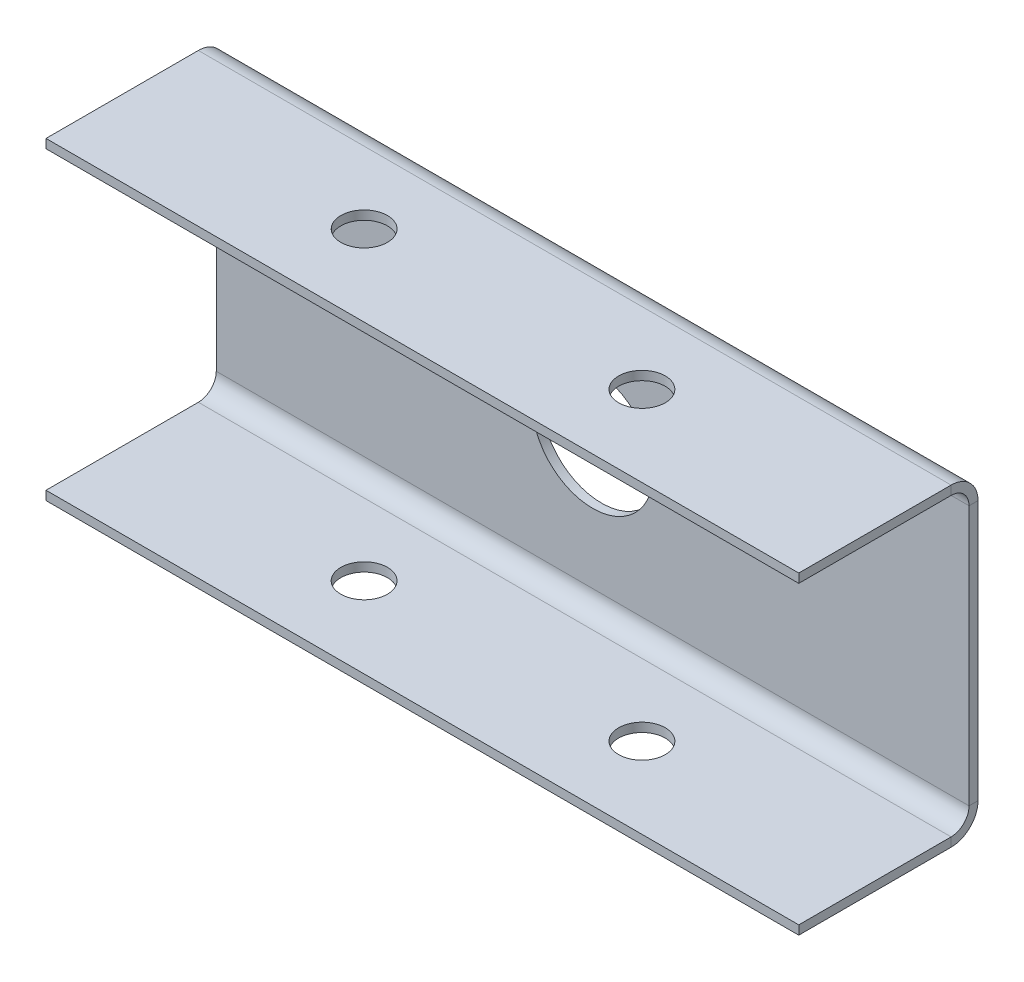
ISO-10303-21;
HEADER;
FILE_DESCRIPTION(('STEP AP214'),'2;1');
FILE_NAME('part.step','',(''),(''),'','','');
FILE_SCHEMA(('AUTOMOTIVE_DESIGN { 1 0 10303 214 1 1 1 1 }'));
ENDSEC;
DATA;
#1=APPLICATION_CONTEXT('core data for automotive mechanical design processes');
#2=APPLICATION_PROTOCOL_DEFINITION('international standard','automotive_design',2000,#1);
#3=PRODUCT_CONTEXT('',#1,'mechanical');
#4=PRODUCT('Part','Part','',(#3));
#5=PRODUCT_RELATED_PRODUCT_CATEGORY('part','',(#4));
#6=PRODUCT_DEFINITION_FORMATION('','',#4);
#7=PRODUCT_DEFINITION_CONTEXT('part definition',#1,'design');
#8=PRODUCT_DEFINITION('design','',#6,#7);
#9=PRODUCT_DEFINITION_SHAPE('','',#8);
#10=(LENGTH_UNIT() NAMED_UNIT(*) SI_UNIT(.MILLI.,.METRE.));
#11=(NAMED_UNIT(*) PLANE_ANGLE_UNIT() SI_UNIT($,.RADIAN.));
#12=(NAMED_UNIT(*) SI_UNIT($,.STERADIAN.) SOLID_ANGLE_UNIT());
#13=UNCERTAINTY_MEASURE_WITH_UNIT(LENGTH_MEASURE(1.E-05),#10,'distance_accuracy_value','');
#14=(GEOMETRIC_REPRESENTATION_CONTEXT(3) GLOBAL_UNCERTAINTY_ASSIGNED_CONTEXT((#13)) GLOBAL_UNIT_ASSIGNED_CONTEXT((#10,
#11,#12)) REPRESENTATION_CONTEXT('',''));
#15=CARTESIAN_POINT('',(0.,0.,0.));
#16=DIRECTION('',(0.,0.,1.));
#17=DIRECTION('',(1.,0.,0.));
#18=AXIS2_PLACEMENT_3D('',#15,#16,#17);
#19=CARTESIAN_POINT('',(84.,14.5,0.));
#20=DIRECTION('',(1.,0.,0.));
#21=DIRECTION('',(0.,0.,-1.));
#22=AXIS2_PLACEMENT_3D('',#19,#20,#21);
#23=PLANE('',#22);
#24=DIRECTION('',(0.,0.,1.));
#25=VECTOR('',#24,1.);
#26=CARTESIAN_POINT('',(84.,14.5,0.));
#27=LINE('',#26,#25);
#28=CARTESIAN_POINT('',(84.,14.5,0.));
#29=VERTEX_POINT('',#28);
#30=CARTESIAN_POINT('',(84.,14.5,1.00000000000001));
#31=VERTEX_POINT('',#30);
#32=EDGE_CURVE('E11',#29,#31,#27,.T.);
#33=ORIENTED_EDGE('',*,*,#32,.F.);
#34=CARTESIAN_POINT('',(84.,14.5,3.00000000000001));
#35=DIRECTION('',(1.,0.,0.));
#36=DIRECTION('',(0.,0.,-1.));
#37=AXIS2_PLACEMENT_3D('',#34,#35,#36);
#38=CIRCLE('',#37,3.);
#39=CARTESIAN_POINT('',(84.,17.5,3.00000000000001));
#40=VERTEX_POINT('',#39);
#41=EDGE_CURVE('E279',#40,#29,#38,.F.);
#42=ORIENTED_EDGE('',*,*,#41,.F.);
#43=DIRECTION('',(0.,1.,0.));
#44=VECTOR('',#43,1.);
#45=CARTESIAN_POINT('',(84.,16.5,3.00000000000001));
#46=LINE('',#45,#44);
#47=CARTESIAN_POINT('',(84.,16.5,3.00000000000001));
#48=VERTEX_POINT('',#47);
#49=EDGE_CURVE('E47',#48,#40,#46,.T.);
#50=ORIENTED_EDGE('',*,*,#49,.F.);
#51=CARTESIAN_POINT('',(84.,14.5,3.00000000000001));
#52=DIRECTION('',(1.,0.,0.));
#53=DIRECTION('',(0.,0.,-1.));
#54=AXIS2_PLACEMENT_3D('',#51,#52,#53);
#55=CIRCLE('',#54,2.);
#56=EDGE_CURVE('E149',#48,#31,#55,.F.);
#57=ORIENTED_EDGE('',*,*,#56,.T.);
#58=EDGE_LOOP('',(#33,#42,#50,#57));
#59=FACE_BOUND('',#58,.T.);
#60=ADVANCED_FACE('F38',(#59),#23,.T.);
#61=CARTESIAN_POINT('',(84.,16.5,3.00000000000001));
#62=DIRECTION('',(1.,0.,0.));
#63=DIRECTION('',(0.,0.,-1.));
#64=AXIS2_PLACEMENT_3D('',#61,#62,#63);
#65=PLANE('',#64);
#66=DIRECTION('',(0.,-1.,0.));
#67=VECTOR('',#66,1.);
#68=CARTESIAN_POINT('',(84.,17.5,0.));
#69=LINE('',#68,#67);
#70=CARTESIAN_POINT('',(84.,-14.5,0.));
#71=VERTEX_POINT('',#70);
#72=EDGE_CURVE('E143',#29,#71,#69,.T.);
#73=ORIENTED_EDGE('',*,*,#72,.F.);
#74=ORIENTED_EDGE('',*,*,#32,.T.);
#75=DIRECTION('',(0.,-1.,0.));
#76=VECTOR('',#75,1.);
#77=CARTESIAN_POINT('',(84.,17.5,1.00000000000001));
#78=LINE('',#77,#76);
#79=CARTESIAN_POINT('',(84.,-14.5,0.999999999999996));
#80=VERTEX_POINT('',#79);
#81=EDGE_CURVE('E140',#31,#80,#78,.T.);
#82=ORIENTED_EDGE('',*,*,#81,.T.);
#83=DIRECTION('',(0.,0.,-1.));
#84=VECTOR('',#83,1.);
#85=CARTESIAN_POINT('',(84.,-14.5,0.999999999999996));
#86=LINE('',#85,#84);
#87=EDGE_CURVE('E232',#80,#71,#86,.T.);
#88=ORIENTED_EDGE('',*,*,#87,.T.);
#89=EDGE_LOOP('',(#73,#74,#82,#88));
#90=FACE_BOUND('',#89,.T.);
#91=ADVANCED_FACE('F138',(#90),#65,.T.);
#92=CARTESIAN_POINT('',(0.,17.5,3.00000000000001));
#93=DIRECTION('',(-1.,0.,0.));
#94=DIRECTION('',(0.,0.,1.));
#95=AXIS2_PLACEMENT_3D('',#92,#93,#94);
#96=PLANE('',#95);
#97=DIRECTION('',(0.,-1.,0.));
#98=VECTOR('',#97,1.);
#99=CARTESIAN_POINT('',(0.,17.5,3.00000000000001));
#100=LINE('',#99,#98);
#101=CARTESIAN_POINT('',(0.,17.5,3.00000000000001));
#102=VERTEX_POINT('',#101);
#103=CARTESIAN_POINT('',(0.,16.5,3.00000000000001));
#104=VERTEX_POINT('',#103);
#105=EDGE_CURVE('E237',#102,#104,#100,.T.);
#106=ORIENTED_EDGE('',*,*,#105,.F.);
#107=CARTESIAN_POINT('',(0.,14.5,3.00000000000001));
#108=DIRECTION('',(1.,0.,0.));
#109=DIRECTION('',(0.,0.,-1.));
#110=AXIS2_PLACEMENT_3D('',#107,#108,#109);
#111=CIRCLE('',#110,3.);
#112=CARTESIAN_POINT('',(0.,14.5,0.));
#113=VERTEX_POINT('',#112);
#114=EDGE_CURVE('E189',#102,#113,#111,.F.);
#115=ORIENTED_EDGE('',*,*,#114,.T.);
#116=DIRECTION('',(0.,0.,-1.));
#117=VECTOR('',#116,1.);
#118=CARTESIAN_POINT('',(0.,14.5,1.00000000000001));
#119=LINE('',#118,#117);
#120=CARTESIAN_POINT('',(0.,14.5,1.00000000000001));
#121=VERTEX_POINT('',#120);
#122=EDGE_CURVE('E235',#121,#113,#119,.T.);
#123=ORIENTED_EDGE('',*,*,#122,.F.);
#124=CARTESIAN_POINT('',(0.,14.5,3.00000000000001));
#125=DIRECTION('',(1.,0.,0.));
#126=DIRECTION('',(0.,0.,-1.));
#127=AXIS2_PLACEMENT_3D('',#124,#125,#126);
#128=CIRCLE('',#127,2.);
#129=EDGE_CURVE('E161',#104,#121,#128,.F.);
#130=ORIENTED_EDGE('',*,*,#129,.F.);
#131=EDGE_LOOP('',(#106,#115,#123,#130));
#132=FACE_BOUND('',#131,.T.);
#133=ADVANCED_FACE('F297',(#132),#96,.T.);
#134=CARTESIAN_POINT('',(0.,14.5,1.00000000000001));
#135=DIRECTION('',(-1.,0.,0.));
#136=DIRECTION('',(0.,0.,1.));
#137=AXIS2_PLACEMENT_3D('',#134,#135,#136);
#138=PLANE('',#137);
#139=DIRECTION('',(0.,0.,-1.));
#140=VECTOR('',#139,1.);
#141=CARTESIAN_POINT('',(0.,17.5,0.));
#142=LINE('',#141,#140);
#143=CARTESIAN_POINT('',(0.,17.5,20.));
#144=VERTEX_POINT('',#143);
#145=EDGE_CURVE('E192',#144,#102,#142,.T.);
#146=ORIENTED_EDGE('',*,*,#145,.T.);
#147=ORIENTED_EDGE('',*,*,#105,.T.);
#148=DIRECTION('',(0.,0.,-1.));
#149=VECTOR('',#148,1.);
#150=CARTESIAN_POINT('',(0.,16.5,0.));
#151=LINE('',#150,#149);
#152=CARTESIAN_POINT('',(0.,16.5,20.));
#153=VERTEX_POINT('',#152);
#154=EDGE_CURVE('E198',#153,#104,#151,.T.);
#155=ORIENTED_EDGE('',*,*,#154,.F.);
#156=DIRECTION('',(0.,1.,0.));
#157=VECTOR('',#156,1.);
#158=CARTESIAN_POINT('',(0.,16.5,20.));
#159=LINE('',#158,#157);
#160=EDGE_CURVE('E195',#153,#144,#159,.T.);
#161=ORIENTED_EDGE('',*,*,#160,.T.);
#162=EDGE_LOOP('',(#146,#147,#155,#161));
#163=FACE_BOUND('',#162,.T.);
#164=ADVANCED_FACE('F343',(#163),#138,.T.);
#165=CARTESIAN_POINT('',(84.,-17.5,3.));
#166=DIRECTION('',(1.,0.,0.));
#167=DIRECTION('',(0.,0.,-1.));
#168=AXIS2_PLACEMENT_3D('',#165,#166,#167);
#169=PLANE('',#168);
#170=DIRECTION('',(0.,1.,0.));
#171=VECTOR('',#170,1.);
#172=CARTESIAN_POINT('',(84.,-17.5,3.));
#173=LINE('',#172,#171);
#174=CARTESIAN_POINT('',(84.,-17.5,3.));
#175=VERTEX_POINT('',#174);
#176=CARTESIAN_POINT('',(84.,-16.5,3.));
#177=VERTEX_POINT('',#176);
#178=EDGE_CURVE('E56',#175,#177,#173,.T.);
#179=ORIENTED_EDGE('',*,*,#178,.F.);
#180=CARTESIAN_POINT('',(84.,-14.5,3.));
#181=DIRECTION('',(1.,0.,0.));
#182=DIRECTION('',(0.,0.,-1.));
#183=AXIS2_PLACEMENT_3D('',#180,#181,#182);
#184=CIRCLE('',#183,3.);
#185=EDGE_CURVE('E275',#71,#175,#184,.F.);
#186=ORIENTED_EDGE('',*,*,#185,.F.);
#187=ORIENTED_EDGE('',*,*,#87,.F.);
#188=CARTESIAN_POINT('',(84.,-14.5,3.));
#189=DIRECTION('',(1.,0.,0.));
#190=DIRECTION('',(0.,0.,-1.));
#191=AXIS2_PLACEMENT_3D('',#188,#189,#190);
#192=CIRCLE('',#191,2.);
#193=EDGE_CURVE('E169',#80,#177,#192,.F.);
#194=ORIENTED_EDGE('',*,*,#193,.T.);
#195=EDGE_LOOP('',(#179,#186,#187,#194));
#196=FACE_BOUND('',#195,.T.);
#197=ADVANCED_FACE('F348',(#196),#169,.T.);
#198=CARTESIAN_POINT('',(84.,-14.5,0.999999999999996));
#199=DIRECTION('',(1.,0.,0.));
#200=DIRECTION('',(0.,0.,-1.));
#201=AXIS2_PLACEMENT_3D('',#198,#199,#200);
#202=PLANE('',#201);
#203=DIRECTION('',(0.,0.,1.));
#204=VECTOR('',#203,1.);
#205=CARTESIAN_POINT('',(84.,-17.5,0.));
#206=LINE('',#205,#204);
#207=CARTESIAN_POINT('',(84.,-17.5,20.));
#208=VERTEX_POINT('',#207);
#209=EDGE_CURVE('E272',#175,#208,#206,.T.);
#210=ORIENTED_EDGE('',*,*,#209,.F.);
#211=ORIENTED_EDGE('',*,*,#178,.T.);
#212=DIRECTION('',(0.,0.,1.));
#213=VECTOR('',#212,1.);
#214=CARTESIAN_POINT('',(84.,-16.5,0.));
#215=LINE('',#214,#213);
#216=CARTESIAN_POINT('',(84.,-16.5,20.));
#217=VERTEX_POINT('',#216);
#218=EDGE_CURVE('E110',#177,#217,#215,.T.);
#219=ORIENTED_EDGE('',*,*,#218,.T.);
#220=DIRECTION('',(0.,1.,0.));
#221=VECTOR('',#220,1.);
#222=CARTESIAN_POINT('',(84.,-17.5,20.));
#223=LINE('',#222,#221);
#224=EDGE_CURVE('E269',#208,#217,#223,.T.);
#225=ORIENTED_EDGE('',*,*,#224,.F.);
#226=EDGE_LOOP('',(#210,#211,#219,#225));
#227=FACE_BOUND('',#226,.T.);
#228=ADVANCED_FACE('F324',(#227),#202,.T.);
#229=CARTESIAN_POINT('',(0.,-14.5,0.));
#230=DIRECTION('',(-1.,0.,0.));
#231=DIRECTION('',(0.,0.,1.));
#232=AXIS2_PLACEMENT_3D('',#229,#230,#231);
#233=PLANE('',#232);
#234=DIRECTION('',(0.,0.,1.));
#235=VECTOR('',#234,1.);
#236=CARTESIAN_POINT('',(0.,-14.5,0.));
#237=LINE('',#236,#235);
#238=CARTESIAN_POINT('',(0.,-14.5,0.));
#239=VERTEX_POINT('',#238);
#240=CARTESIAN_POINT('',(0.,-14.5,0.999999999999996));
#241=VERTEX_POINT('',#240);
#242=EDGE_CURVE('E97',#239,#241,#237,.T.);
#243=ORIENTED_EDGE('',*,*,#242,.F.);
#244=CARTESIAN_POINT('',(0.,-14.5,3.));
#245=DIRECTION('',(1.,0.,0.));
#246=DIRECTION('',(0.,0.,-1.));
#247=AXIS2_PLACEMENT_3D('',#244,#245,#246);
#248=CIRCLE('',#247,3.);
#249=CARTESIAN_POINT('',(0.,-17.5,3.));
#250=VERTEX_POINT('',#249);
#251=EDGE_CURVE('E185',#239,#250,#248,.F.);
#252=ORIENTED_EDGE('',*,*,#251,.T.);
#253=DIRECTION('',(0.,-1.,0.));
#254=VECTOR('',#253,1.);
#255=CARTESIAN_POINT('',(0.,-16.5,3.));
#256=LINE('',#255,#254);
#257=CARTESIAN_POINT('',(0.,-16.5,3.));
#258=VERTEX_POINT('',#257);
#259=EDGE_CURVE('E104',#258,#250,#256,.T.);
#260=ORIENTED_EDGE('',*,*,#259,.F.);
#261=CARTESIAN_POINT('',(0.,-14.5,3.));
#262=DIRECTION('',(1.,0.,0.));
#263=DIRECTION('',(0.,0.,-1.));
#264=AXIS2_PLACEMENT_3D('',#261,#262,#263);
#265=CIRCLE('',#264,2.);
#266=EDGE_CURVE('E204',#241,#258,#265,.F.);
#267=ORIENTED_EDGE('',*,*,#266,.F.);
#268=EDGE_LOOP('',(#243,#252,#260,#267));
#269=FACE_BOUND('',#268,.T.);
#270=ADVANCED_FACE('F312',(#269),#233,.T.);
#271=CARTESIAN_POINT('',(0.,-16.5,3.));
#272=DIRECTION('',(-1.,0.,0.));
#273=DIRECTION('',(0.,0.,1.));
#274=AXIS2_PLACEMENT_3D('',#271,#272,#273);
#275=PLANE('',#274);
#276=DIRECTION('',(0.,-1.,0.));
#277=VECTOR('',#276,1.);
#278=CARTESIAN_POINT('',(0.,17.5,0.));
#279=LINE('',#278,#277);
#280=EDGE_CURVE('E187',#113,#239,#279,.T.);
#281=ORIENTED_EDGE('',*,*,#280,.T.);
#282=ORIENTED_EDGE('',*,*,#242,.T.);
#283=DIRECTION('',(0.,-1.,0.));
#284=VECTOR('',#283,1.);
#285=CARTESIAN_POINT('',(0.,17.5,1.00000000000001));
#286=LINE('',#285,#284);
#287=EDGE_CURVE('E202',#121,#241,#286,.T.);
#288=ORIENTED_EDGE('',*,*,#287,.F.);
#289=ORIENTED_EDGE('',*,*,#122,.T.);
#290=EDGE_LOOP('',(#281,#282,#288,#289));
#291=FACE_BOUND('',#290,.T.);
#292=ADVANCED_FACE('F299',(#291),#275,.T.);
#293=CARTESIAN_POINT('',(84.,-16.5,0.));
#294=DIRECTION('',(0.,-1.,0.));
#295=DIRECTION('',(0.,0.,-1.));
#296=AXIS2_PLACEMENT_3D('',#293,#294,#295);
#297=PLANE('',#296);
#298=CARTESIAN_POINT('',(57.5,-16.5,11.));
#299=DIRECTION('',(0.,-1.,0.));
#300=DIRECTION('',(0.,0.,-1.));
#301=AXIS2_PLACEMENT_3D('',#298,#299,#300);
#302=CIRCLE('',#301,2.6);
#303=CARTESIAN_POINT('',(57.5,-16.5,8.4));
#304=VERTEX_POINT('',#303);
#305=EDGE_CURVE('E245',#304,#304,#302,.T.);
#306=ORIENTED_EDGE('',*,*,#305,.T.);
#307=EDGE_LOOP('',(#306));
#308=FACE_BOUND('',#307,.T.);
#309=CARTESIAN_POINT('',(26.5,-16.5,11.));
#310=DIRECTION('',(0.,-1.,0.));
#311=DIRECTION('',(0.,0.,-1.));
#312=AXIS2_PLACEMENT_3D('',#309,#310,#311);
#313=CIRCLE('',#312,2.6);
#314=CARTESIAN_POINT('',(26.5,-16.5,8.4));
#315=VERTEX_POINT('',#314);
#316=EDGE_CURVE('E179',#315,#315,#313,.T.);
#317=ORIENTED_EDGE('',*,*,#316,.T.);
#318=EDGE_LOOP('',(#317));
#319=FACE_BOUND('',#318,.T.);
#320=DIRECTION('',(0.,0.,1.));
#321=VECTOR('',#320,1.);
#322=CARTESIAN_POINT('',(0.,-16.5,0.));
#323=LINE('',#322,#321);
#324=CARTESIAN_POINT('',(0.,-16.5,20.));
#325=VERTEX_POINT('',#324);
#326=EDGE_CURVE('E175',#258,#325,#323,.T.);
#327=ORIENTED_EDGE('',*,*,#326,.T.);
#328=DIRECTION('',(-1.,0.,0.));
#329=VECTOR('',#328,1.);
#330=CARTESIAN_POINT('',(84.,-16.5,20.));
#331=LINE('',#330,#329);
#332=EDGE_CURVE('E228',#217,#325,#331,.T.);
#333=ORIENTED_EDGE('',*,*,#332,.F.);
#334=ORIENTED_EDGE('',*,*,#218,.F.);
#335=DIRECTION('',(-1.,0.,0.));
#336=VECTOR('',#335,1.);
#337=CARTESIAN_POINT('',(84.,-16.5,3.));
#338=LINE('',#337,#336);
#339=EDGE_CURVE('E171',#177,#258,#338,.T.);
#340=ORIENTED_EDGE('',*,*,#339,.T.);
#341=EDGE_LOOP('',(#327,#333,#334,#340));
#342=FACE_BOUND('',#341,.T.);
#343=ADVANCED_FACE('F318',(#308,#319,#342),#297,.F.);
#344=CARTESIAN_POINT('',(84.,-17.5,20.));
#345=DIRECTION('',(0.,0.,1.));
#346=DIRECTION('',(1.,0.,0.));
#347=AXIS2_PLACEMENT_3D('',#344,#345,#346);
#348=PLANE('',#347);
#349=DIRECTION('',(0.,1.,0.));
#350=VECTOR('',#349,1.);
#351=CARTESIAN_POINT('',(0.,-17.5,20.));
#352=LINE('',#351,#350);
#353=CARTESIAN_POINT('',(0.,-17.5,20.));
#354=VERTEX_POINT('',#353);
#355=EDGE_CURVE('E178',#354,#325,#352,.T.);
#356=ORIENTED_EDGE('',*,*,#355,.F.);
#357=DIRECTION('',(-1.,0.,0.));
#358=VECTOR('',#357,1.);
#359=CARTESIAN_POINT('',(84.,-17.5,20.));
#360=LINE('',#359,#358);
#361=EDGE_CURVE('E226',#208,#354,#360,.T.);
#362=ORIENTED_EDGE('',*,*,#361,.F.);
#363=ORIENTED_EDGE('',*,*,#224,.T.);
#364=ORIENTED_EDGE('',*,*,#332,.T.);
#365=EDGE_LOOP('',(#356,#362,#363,#364));
#366=FACE_BOUND('',#365,.T.);
#367=ADVANCED_FACE('F323',(#366),#348,.T.);
#368=CARTESIAN_POINT('',(84.,-17.5,0.));
#369=DIRECTION('',(0.,-1.,0.));
#370=DIRECTION('',(0.,0.,-1.));
#371=AXIS2_PLACEMENT_3D('',#368,#369,#370);
#372=PLANE('',#371);
#373=CARTESIAN_POINT('',(57.5,-17.5,11.));
#374=DIRECTION('',(0.,1.,0.));
#375=DIRECTION('',(0.,0.,1.));
#376=AXIS2_PLACEMENT_3D('',#373,#374,#375);
#377=CIRCLE('',#376,2.6);
#378=CARTESIAN_POINT('',(57.5,-17.5,13.6));
#379=VERTEX_POINT('',#378);
#380=EDGE_CURVE('E246',#379,#379,#377,.T.);
#381=ORIENTED_EDGE('',*,*,#380,.T.);
#382=EDGE_LOOP('',(#381));
#383=FACE_BOUND('',#382,.T.);
#384=CARTESIAN_POINT('',(26.5,-17.5,11.));
#385=DIRECTION('',(0.,1.,0.));
#386=DIRECTION('',(0.,0.,1.));
#387=AXIS2_PLACEMENT_3D('',#384,#385,#386);
#388=CIRCLE('',#387,2.6);
#389=CARTESIAN_POINT('',(26.5,-17.5,13.6));
#390=VERTEX_POINT('',#389);
#391=EDGE_CURVE('E242',#390,#390,#388,.T.);
#392=ORIENTED_EDGE('',*,*,#391,.T.);
#393=EDGE_LOOP('',(#392));
#394=FACE_BOUND('',#393,.T.);
#395=DIRECTION('',(0.,0.,1.));
#396=VECTOR('',#395,1.);
#397=CARTESIAN_POINT('',(0.,-17.5,0.));
#398=LINE('',#397,#396);
#399=EDGE_CURVE('E182',#250,#354,#398,.T.);
#400=ORIENTED_EDGE('',*,*,#399,.F.);
#401=DIRECTION('',(-1.,0.,0.));
#402=VECTOR('',#401,1.);
#403=CARTESIAN_POINT('',(84.,-17.5,3.));
#404=LINE('',#403,#402);
#405=EDGE_CURVE('E223',#175,#250,#404,.T.);
#406=ORIENTED_EDGE('',*,*,#405,.F.);
#407=ORIENTED_EDGE('',*,*,#209,.T.);
#408=ORIENTED_EDGE('',*,*,#361,.T.);
#409=EDGE_LOOP('',(#400,#406,#407,#408));
#410=FACE_BOUND('',#409,.T.);
#411=ADVANCED_FACE('F326',(#383,#394,#410),#372,.T.);
#412=CARTESIAN_POINT('',(84.,-14.5,3.));
#413=DIRECTION('',(-1.,0.,0.));
#414=DIRECTION('',(0.,0.,1.));
#415=AXIS2_PLACEMENT_3D('',#412,#413,#414);
#416=CYLINDRICAL_SURFACE('',#415,3.);
#417=ORIENTED_EDGE('',*,*,#251,.F.);
#418=DIRECTION('',(-1.,0.,0.));
#419=VECTOR('',#418,1.);
#420=CARTESIAN_POINT('',(84.,-14.5,0.));
#421=LINE('',#420,#419);
#422=EDGE_CURVE('E220',#71,#239,#421,.T.);
#423=ORIENTED_EDGE('',*,*,#422,.F.);
#424=ORIENTED_EDGE('',*,*,#185,.T.);
#425=ORIENTED_EDGE('',*,*,#405,.T.);
#426=EDGE_LOOP('',(#417,#423,#424,#425));
#427=FACE_BOUND('',#426,.T.);
#428=ADVANCED_FACE('F309',(#427),#416,.T.);
#429=CARTESIAN_POINT('',(84.,17.5,0.));
#430=DIRECTION('',(0.,0.,-1.));
#431=DIRECTION('',(0.,1.,0.));
#432=AXIS2_PLACEMENT_3D('',#429,#430,#431);
#433=PLANE('',#432);
#434=CARTESIAN_POINT('',(42.,0.,0.));
#435=DIRECTION('',(0.,0.,-1.));
#436=DIRECTION('',(-1.,0.,0.));
#437=AXIS2_PLACEMENT_3D('',#434,#435,#436);
#438=CIRCLE('',#437,6.75);
#439=CARTESIAN_POINT('',(35.25,0.,0.));
#440=VERTEX_POINT('',#439);
#441=EDGE_CURVE('E260',#440,#440,#438,.T.);
#442=ORIENTED_EDGE('',*,*,#441,.F.);
#443=EDGE_LOOP('',(#442));
#444=FACE_BOUND('',#443,.T.);
#445=ORIENTED_EDGE('',*,*,#280,.F.);
#446=DIRECTION('',(-1.,0.,0.));
#447=VECTOR('',#446,1.);
#448=CARTESIAN_POINT('',(84.,14.5,0.));
#449=LINE('',#448,#447);
#450=EDGE_CURVE('E217',#29,#113,#449,.T.);
#451=ORIENTED_EDGE('',*,*,#450,.F.);
#452=ORIENTED_EDGE('',*,*,#72,.T.);
#453=ORIENTED_EDGE('',*,*,#422,.T.);
#454=EDGE_LOOP('',(#445,#451,#452,#453));
#455=FACE_BOUND('',#454,.T.);
#456=ADVANCED_FACE('F304',(#444,#455),#433,.T.);
#457=CARTESIAN_POINT('',(84.,14.5,3.00000000000001));
#458=DIRECTION('',(-1.,0.,0.));
#459=DIRECTION('',(0.,0.,1.));
#460=AXIS2_PLACEMENT_3D('',#457,#458,#459);
#461=CYLINDRICAL_SURFACE('',#460,3.);
#462=ORIENTED_EDGE('',*,*,#114,.F.);
#463=DIRECTION('',(-1.,0.,0.));
#464=VECTOR('',#463,1.);
#465=CARTESIAN_POINT('',(84.,17.5,3.00000000000001));
#466=LINE('',#465,#464);
#467=EDGE_CURVE('E214',#40,#102,#466,.T.);
#468=ORIENTED_EDGE('',*,*,#467,.F.);
#469=ORIENTED_EDGE('',*,*,#41,.T.);
#470=ORIENTED_EDGE('',*,*,#450,.T.);
#471=EDGE_LOOP('',(#462,#468,#469,#470));
#472=FACE_BOUND('',#471,.T.);
#473=ADVANCED_FACE('F302',(#472),#461,.T.);
#474=CARTESIAN_POINT('',(84.,17.5,0.));
#475=DIRECTION('',(0.,1.,0.));
#476=DIRECTION('',(0.,0.,1.));
#477=AXIS2_PLACEMENT_3D('',#474,#475,#476);
#478=PLANE('',#477);
#479=CARTESIAN_POINT('',(57.5,17.5,11.));
#480=DIRECTION('',(0.,1.,0.));
#481=DIRECTION('',(0.,0.,1.));
#482=AXIS2_PLACEMENT_3D('',#479,#480,#481);
#483=CIRCLE('',#482,2.6);
#484=CARTESIAN_POINT('',(57.5,17.5,13.6));
#485=VERTEX_POINT('',#484);
#486=EDGE_CURVE('E253',#485,#485,#483,.T.);
#487=ORIENTED_EDGE('',*,*,#486,.F.);
#488=EDGE_LOOP('',(#487));
#489=FACE_BOUND('',#488,.T.);
#490=CARTESIAN_POINT('',(26.5,17.5,11.));
#491=DIRECTION('',(0.,1.,0.));
#492=DIRECTION('',(0.,0.,1.));
#493=AXIS2_PLACEMENT_3D('',#490,#491,#492);
#494=CIRCLE('',#493,2.6);
#495=CARTESIAN_POINT('',(26.5,17.5,13.6));
#496=VERTEX_POINT('',#495);
#497=EDGE_CURVE('E250',#496,#496,#494,.T.);
#498=ORIENTED_EDGE('',*,*,#497,.F.);
#499=EDGE_LOOP('',(#498));
#500=FACE_BOUND('',#499,.T.);
#501=ORIENTED_EDGE('',*,*,#145,.F.);
#502=DIRECTION('',(-1.,0.,0.));
#503=VECTOR('',#502,1.);
#504=CARTESIAN_POINT('',(84.,17.5,20.));
#505=LINE('',#504,#503);
#506=CARTESIAN_POINT('',(84.,17.5,20.));
#507=VERTEX_POINT('',#506);
#508=EDGE_CURVE('E212',#507,#144,#505,.T.);
#509=ORIENTED_EDGE('',*,*,#508,.F.);
#510=DIRECTION('',(0.,0.,-1.));
#511=VECTOR('',#510,1.);
#512=CARTESIAN_POINT('',(84.,17.5,0.));
#513=LINE('',#512,#511);
#514=EDGE_CURVE('E281',#507,#40,#513,.T.);
#515=ORIENTED_EDGE('',*,*,#514,.T.);
#516=ORIENTED_EDGE('',*,*,#467,.T.);
#517=EDGE_LOOP('',(#501,#509,#515,#516));
#518=FACE_BOUND('',#517,.T.);
#519=ADVANCED_FACE('F400',(#489,#500,#518),#478,.T.);
#520=CARTESIAN_POINT('',(84.,16.5,20.));
#521=DIRECTION('',(0.,0.,1.));
#522=DIRECTION('',(1.,0.,0.));
#523=AXIS2_PLACEMENT_3D('',#520,#521,#522);
#524=PLANE('',#523);
#525=ORIENTED_EDGE('',*,*,#160,.F.);
#526=DIRECTION('',(-1.,0.,0.));
#527=VECTOR('',#526,1.);
#528=CARTESIAN_POINT('',(84.,16.5,20.));
#529=LINE('',#528,#527);
#530=CARTESIAN_POINT('',(84.,16.5,20.));
#531=VERTEX_POINT('',#530);
#532=EDGE_CURVE('E210',#531,#153,#529,.T.);
#533=ORIENTED_EDGE('',*,*,#532,.F.);
#534=DIRECTION('',(0.,1.,0.));
#535=VECTOR('',#534,1.);
#536=CARTESIAN_POINT('',(84.,16.5,20.));
#537=LINE('',#536,#535);
#538=EDGE_CURVE('E284',#531,#507,#537,.T.);
#539=ORIENTED_EDGE('',*,*,#538,.T.);
#540=ORIENTED_EDGE('',*,*,#508,.T.);
#541=EDGE_LOOP('',(#525,#533,#539,#540));
#542=FACE_BOUND('',#541,.T.);
#543=ADVANCED_FACE('F397',(#542),#524,.T.);
#544=CARTESIAN_POINT('',(84.,16.5,0.));
#545=DIRECTION('',(0.,1.,0.));
#546=DIRECTION('',(0.,0.,1.));
#547=AXIS2_PLACEMENT_3D('',#544,#545,#546);
#548=PLANE('',#547);
#549=CARTESIAN_POINT('',(57.5,16.5,11.));
#550=DIRECTION('',(0.,1.,0.));
#551=DIRECTION('',(0.,0.,1.));
#552=AXIS2_PLACEMENT_3D('',#549,#550,#551);
#553=CIRCLE('',#552,2.6);
#554=CARTESIAN_POINT('',(57.5,16.5,13.6));
#555=VERTEX_POINT('',#554);
#556=EDGE_CURVE('E243',#555,#555,#553,.T.);
#557=ORIENTED_EDGE('',*,*,#556,.T.);
#558=EDGE_LOOP('',(#557));
#559=FACE_BOUND('',#558,.T.);
#560=CARTESIAN_POINT('',(26.5,16.5,11.));
#561=DIRECTION('',(0.,1.,0.));
#562=DIRECTION('',(0.,0.,1.));
#563=AXIS2_PLACEMENT_3D('',#560,#561,#562);
#564=CIRCLE('',#563,2.6);
#565=CARTESIAN_POINT('',(26.5,16.5,13.6));
#566=VERTEX_POINT('',#565);
#567=EDGE_CURVE('E240',#566,#566,#564,.T.);
#568=ORIENTED_EDGE('',*,*,#567,.T.);
#569=EDGE_LOOP('',(#568));
#570=FACE_BOUND('',#569,.T.);
#571=ORIENTED_EDGE('',*,*,#154,.T.);
#572=DIRECTION('',(-1.,0.,0.));
#573=VECTOR('',#572,1.);
#574=CARTESIAN_POINT('',(84.,16.5,3.00000000000001));
#575=LINE('',#574,#573);
#576=EDGE_CURVE('E163',#48,#104,#575,.T.);
#577=ORIENTED_EDGE('',*,*,#576,.F.);
#578=DIRECTION('',(0.,0.,-1.));
#579=VECTOR('',#578,1.);
#580=CARTESIAN_POINT('',(84.,16.5,0.));
#581=LINE('',#580,#579);
#582=EDGE_CURVE('E154',#531,#48,#581,.T.);
#583=ORIENTED_EDGE('',*,*,#582,.F.);
#584=ORIENTED_EDGE('',*,*,#532,.T.);
#585=EDGE_LOOP('',(#571,#577,#583,#584));
#586=FACE_BOUND('',#585,.T.);
#587=ADVANCED_FACE('F294',(#559,#570,#586),#548,.F.);
#588=CARTESIAN_POINT('',(84.,14.5,3.00000000000001));
#589=DIRECTION('',(-1.,0.,0.));
#590=DIRECTION('',(0.,0.,1.));
#591=AXIS2_PLACEMENT_3D('',#588,#589,#590);
#592=CYLINDRICAL_SURFACE('',#591,2.);
#593=ORIENTED_EDGE('',*,*,#129,.T.);
#594=DIRECTION('',(-1.,0.,0.));
#595=VECTOR('',#594,1.);
#596=CARTESIAN_POINT('',(84.,14.5,1.00000000000001));
#597=LINE('',#596,#595);
#598=EDGE_CURVE('E158',#31,#121,#597,.T.);
#599=ORIENTED_EDGE('',*,*,#598,.F.);
#600=ORIENTED_EDGE('',*,*,#56,.F.);
#601=ORIENTED_EDGE('',*,*,#576,.T.);
#602=EDGE_LOOP('',(#593,#599,#600,#601));
#603=FACE_BOUND('',#602,.T.);
#604=ADVANCED_FACE('F159',(#603),#592,.F.);
#605=CARTESIAN_POINT('',(84.,17.5,1.00000000000001));
#606=DIRECTION('',(0.,0.,-1.));
#607=DIRECTION('',(0.,1.,0.));
#608=AXIS2_PLACEMENT_3D('',#605,#606,#607);
#609=PLANE('',#608);
#610=CARTESIAN_POINT('',(42.,0.,1.));
#611=DIRECTION('',(0.,0.,-1.));
#612=DIRECTION('',(0.,1.,0.));
#613=AXIS2_PLACEMENT_3D('',#610,#611,#612);
#614=CIRCLE('',#613,6.75);
#615=CARTESIAN_POINT('',(35.25,0.,1.));
#616=VERTEX_POINT('',#615);
#617=EDGE_CURVE('E41',#616,#616,#614,.T.);
#618=ORIENTED_EDGE('',*,*,#617,.T.);
#619=EDGE_LOOP('',(#618));
#620=FACE_BOUND('',#619,.T.);
#621=ORIENTED_EDGE('',*,*,#287,.T.);
#622=DIRECTION('',(-1.,0.,0.));
#623=VECTOR('',#622,1.);
#624=CARTESIAN_POINT('',(84.,-14.5,0.999999999999996));
#625=LINE('',#624,#623);
#626=EDGE_CURVE('E164',#80,#241,#625,.T.);
#627=ORIENTED_EDGE('',*,*,#626,.F.);
#628=ORIENTED_EDGE('',*,*,#81,.F.);
#629=ORIENTED_EDGE('',*,*,#598,.T.);
#630=EDGE_LOOP('',(#621,#627,#628,#629));
#631=FACE_BOUND('',#630,.T.);
#632=ADVANCED_FACE('F166',(#620,#631),#609,.F.);
#633=CARTESIAN_POINT('',(84.,-14.5,3.));
#634=DIRECTION('',(-1.,0.,0.));
#635=DIRECTION('',(0.,0.,1.));
#636=AXIS2_PLACEMENT_3D('',#633,#634,#635);
#637=CYLINDRICAL_SURFACE('',#636,2.);
#638=ORIENTED_EDGE('',*,*,#266,.T.);
#639=ORIENTED_EDGE('',*,*,#339,.F.);
#640=ORIENTED_EDGE('',*,*,#193,.F.);
#641=ORIENTED_EDGE('',*,*,#626,.T.);
#642=EDGE_LOOP('',(#638,#639,#640,#641));
#643=FACE_BOUND('',#642,.T.);
#644=ADVANCED_FACE('F315',(#643),#637,.F.);
#645=CARTESIAN_POINT('',(84.,-14.5,3.));
#646=DIRECTION('',(1.,0.,0.));
#647=DIRECTION('',(0.,0.,-1.));
#648=AXIS2_PLACEMENT_3D('',#645,#646,#647);
#649=PLANE('',#648);
#650=ORIENTED_EDGE('',*,*,#582,.T.);
#651=ORIENTED_EDGE('',*,*,#49,.T.);
#652=ORIENTED_EDGE('',*,*,#514,.F.);
#653=ORIENTED_EDGE('',*,*,#538,.F.);
#654=EDGE_LOOP('',(#650,#651,#652,#653));
#655=FACE_BOUND('',#654,.T.);
#656=ADVANCED_FACE('F290',(#655),#649,.T.);
#657=CARTESIAN_POINT('',(0.,-14.5,3.));
#658=DIRECTION('',(1.,0.,0.));
#659=DIRECTION('',(0.,0.,-1.));
#660=AXIS2_PLACEMENT_3D('',#657,#658,#659);
#661=PLANE('',#660);
#662=ORIENTED_EDGE('',*,*,#326,.F.);
#663=ORIENTED_EDGE('',*,*,#259,.T.);
#664=ORIENTED_EDGE('',*,*,#399,.T.);
#665=ORIENTED_EDGE('',*,*,#355,.T.);
#666=EDGE_LOOP('',(#662,#663,#664,#665));
#667=FACE_BOUND('',#666,.T.);
#668=ADVANCED_FACE('F320',(#667),#661,.F.);
#669=CARTESIAN_POINT('',(26.5,-17.5,11.));
#670=DIRECTION('',(0.,1.,0.));
#671=DIRECTION('',(0.,0.,1.));
#672=AXIS2_PLACEMENT_3D('',#669,#670,#671);
#673=CYLINDRICAL_SURFACE('',#672,2.6);
#674=ORIENTED_EDGE('',*,*,#497,.T.);
#675=EDGE_LOOP('',(#674));
#676=FACE_BOUND('',#675,.T.);
#677=ORIENTED_EDGE('',*,*,#567,.F.);
#678=EDGE_LOOP('',(#677));
#679=FACE_BOUND('',#678,.T.);
#680=ADVANCED_FACE('F370',(#676,#679),#673,.F.);
#681=ORIENTED_EDGE('',*,*,#391,.F.);
#682=EDGE_LOOP('',(#681));
#683=FACE_BOUND('',#682,.T.);
#684=ORIENTED_EDGE('',*,*,#316,.F.);
#685=EDGE_LOOP('',(#684));
#686=FACE_BOUND('',#685,.T.);
#687=ADVANCED_FACE('F367',(#683,#686),#673,.F.);
#688=CARTESIAN_POINT('',(57.5,-17.5,11.));
#689=DIRECTION('',(0.,1.,0.));
#690=DIRECTION('',(0.,0.,1.));
#691=AXIS2_PLACEMENT_3D('',#688,#689,#690);
#692=CYLINDRICAL_SURFACE('',#691,2.6);
#693=ORIENTED_EDGE('',*,*,#486,.T.);
#694=EDGE_LOOP('',(#693));
#695=FACE_BOUND('',#694,.T.);
#696=ORIENTED_EDGE('',*,*,#556,.F.);
#697=EDGE_LOOP('',(#696));
#698=FACE_BOUND('',#697,.T.);
#699=ADVANCED_FACE('F369',(#695,#698),#692,.F.);
#700=ORIENTED_EDGE('',*,*,#380,.F.);
#701=EDGE_LOOP('',(#700));
#702=FACE_BOUND('',#701,.T.);
#703=ORIENTED_EDGE('',*,*,#305,.F.);
#704=EDGE_LOOP('',(#703));
#705=FACE_BOUND('',#704,.T.);
#706=ADVANCED_FACE('F377',(#702,#705),#692,.F.);
#707=CARTESIAN_POINT('',(42.,0.,20.));
#708=DIRECTION('',(0.,0.,-1.));
#709=DIRECTION('',(-1.,0.,0.));
#710=AXIS2_PLACEMENT_3D('',#707,#708,#709);
#711=CYLINDRICAL_SURFACE('',#710,6.75);
#712=CARTESIAN_POINT('',(35.25,0.,0.));
#713=CARTESIAN_POINT('',(35.25,0.,0.0104166666666667));
#714=CARTESIAN_POINT('',(35.25,0.,0.0208333333333333));
#715=CARTESIAN_POINT('',(35.25,0.,0.0416666666666667));
#716=CARTESIAN_POINT('',(35.25,0.,0.0520833333333334));
#717=CARTESIAN_POINT('',(35.25,0.,0.0729166666666667));
#718=CARTESIAN_POINT('',(35.25,0.,0.0833333333333334));
#719=CARTESIAN_POINT('',(35.25,0.,0.104166666666667));
#720=CARTESIAN_POINT('',(35.25,0.,0.114583333333333));
#721=CARTESIAN_POINT('',(35.25,0.,0.135416666666667));
#722=CARTESIAN_POINT('',(35.25,0.,0.145833333333333));
#723=CARTESIAN_POINT('',(35.25,0.,0.166666666666667));
#724=CARTESIAN_POINT('',(35.25,0.,0.177083333333333));
#725=CARTESIAN_POINT('',(35.25,0.,0.197916666666667));
#726=CARTESIAN_POINT('',(35.25,0.,0.208333333333334));
#727=CARTESIAN_POINT('',(35.25,0.,0.229166666666667));
#728=CARTESIAN_POINT('',(35.25,0.,0.239583333333334));
#729=CARTESIAN_POINT('',(35.25,0.,0.260416666666667));
#730=CARTESIAN_POINT('',(35.25,0.,0.270833333333334));
#731=CARTESIAN_POINT('',(35.25,0.,0.291666666666667));
#732=CARTESIAN_POINT('',(35.25,0.,0.302083333333334));
#733=CARTESIAN_POINT('',(35.25,0.,0.322916666666667));
#734=CARTESIAN_POINT('',(35.25,0.,0.333333333333334));
#735=CARTESIAN_POINT('',(35.25,0.,0.354166666666667));
#736=CARTESIAN_POINT('',(35.25,0.,0.364583333333334));
#737=CARTESIAN_POINT('',(35.25,0.,0.385416666666667));
#738=CARTESIAN_POINT('',(35.25,0.,0.395833333333334));
#739=CARTESIAN_POINT('',(35.25,0.,0.416666666666667));
#740=CARTESIAN_POINT('',(35.25,0.,0.427083333333334));
#741=CARTESIAN_POINT('',(35.25,0.,0.447916666666667));
#742=CARTESIAN_POINT('',(35.25,0.,0.458333333333334));
#743=CARTESIAN_POINT('',(35.25,0.,0.479166666666667));
#744=CARTESIAN_POINT('',(35.25,0.,0.489583333333334));
#745=CARTESIAN_POINT('',(35.25,0.,0.510416666666667));
#746=CARTESIAN_POINT('',(35.25,0.,0.520833333333334));
#747=CARTESIAN_POINT('',(35.25,0.,0.541666666666667));
#748=CARTESIAN_POINT('',(35.25,0.,0.552083333333334));
#749=CARTESIAN_POINT('',(35.25,0.,0.572916666666667));
#750=CARTESIAN_POINT('',(35.25,0.,0.583333333333334));
#751=CARTESIAN_POINT('',(35.25,0.,0.604166666666667));
#752=CARTESIAN_POINT('',(35.25,0.,0.614583333333334));
#753=CARTESIAN_POINT('',(35.25,0.,0.635416666666667));
#754=CARTESIAN_POINT('',(35.25,0.,0.645833333333334));
#755=CARTESIAN_POINT('',(35.25,0.,0.666666666666667));
#756=CARTESIAN_POINT('',(35.25,0.,0.677083333333334));
#757=CARTESIAN_POINT('',(35.25,0.,0.697916666666667));
#758=CARTESIAN_POINT('',(35.25,0.,0.708333333333334));
#759=CARTESIAN_POINT('',(35.25,0.,0.729166666666667));
#760=CARTESIAN_POINT('',(35.25,0.,0.739583333333334));
#761=CARTESIAN_POINT('',(35.25,0.,0.760416666666667));
#762=CARTESIAN_POINT('',(35.25,0.,0.770833333333334));
#763=CARTESIAN_POINT('',(35.25,0.,0.791666666666667));
#764=CARTESIAN_POINT('',(35.25,0.,0.802083333333334));
#765=CARTESIAN_POINT('',(35.25,0.,0.822916666666667));
#766=CARTESIAN_POINT('',(35.25,0.,0.833333333333334));
#767=CARTESIAN_POINT('',(35.25,0.,0.854166666666667));
#768=CARTESIAN_POINT('',(35.25,0.,0.864583333333334));
#769=CARTESIAN_POINT('',(35.25,0.,0.885416666666668));
#770=CARTESIAN_POINT('',(35.25,0.,0.895833333333334));
#771=CARTESIAN_POINT('',(35.25,0.,0.916666666666668));
#772=CARTESIAN_POINT('',(35.25,0.,0.927083333333334));
#773=CARTESIAN_POINT('',(35.25,0.,0.947916666666668));
#774=CARTESIAN_POINT('',(35.25,0.,0.958333333333334));
#775=CARTESIAN_POINT('',(35.25,0.,0.979166666666668));
#776=CARTESIAN_POINT('',(35.25,0.,0.989583333333334));
#777=CARTESIAN_POINT('',(35.25,0.,1.));
#778=B_SPLINE_CURVE_WITH_KNOTS('',3,(#712,#713,#714,#715,#716,#717,#718,#719,#720,#721,#722,
#723,#724,#725,#726,#727,#728,#729,#730,#731,#732,#733,#734,#735,#736,#737,#738,#739,#740,#741,
#742,#743,#744,#745,#746,#747,#748,#749,#750,#751,#752,#753,#754,#755,#756,#757,#758,#759,#760,
#761,#762,#763,#764,#765,#766,#767,#768,#769,#770,#771,#772,#773,#774,#775,#776,#777),
.UNSPECIFIED.,.F.,.F.,(4,2,2,2,2,2,2,2,2,2,2,2,2,2,2,2,2,2,2,2,2,2,2,2,2,2,2,2,2,2,2,2,4),(0.,
0.03125,0.0625000000000001,0.0937500000000001,0.125,0.15625,0.1875,0.21875,0.25,0.28125,0.3125,
0.34375,0.375,0.40625,0.4375,0.46875,0.5,0.53125,0.5625,0.593750000000001,0.625000000000001,
0.656250000000001,0.687500000000001,0.718750000000001,0.750000000000001,0.781250000000001,
0.812500000000001,0.843750000000001,0.875000000000001,0.906250000000001,0.937500000000001,
0.968750000000001,1.),.UNSPECIFIED.);
#779=EDGE_CURVE('BSEAM417',#440,#616,#778,.T.);
#780=ORIENTED_EDGE('',*,*,#441,.T.);
#781=ORIENTED_EDGE('',*,*,#617,.F.);
#782=ORIENTED_EDGE('',*,*,#779,.T.);
#783=ORIENTED_EDGE('',*,*,#779,.F.);
#784=EDGE_LOOP('',(#780,#782,#781,#783));
#785=FACE_BOUND('',#784,.T.);
#786=ADVANCED_FACE('F417',(#785),#711,.F.);
#787=CLOSED_SHELL('',(#60,#91,#133,#164,#197,#228,#270,#292,#343,#367,#411,#428,#456,#473,#519,
#543,#587,#604,#632,#644,#656,#668,#680,#687,#699,#706,#786));
#788=MANIFOLD_SOLID_BREP('B2',#787);
#789=ADVANCED_BREP_SHAPE_REPRESENTATION('',(#18,#788),#14);
#790=SHAPE_DEFINITION_REPRESENTATION(#9,#789);
ENDSEC;
END-ISO-10303-21;
